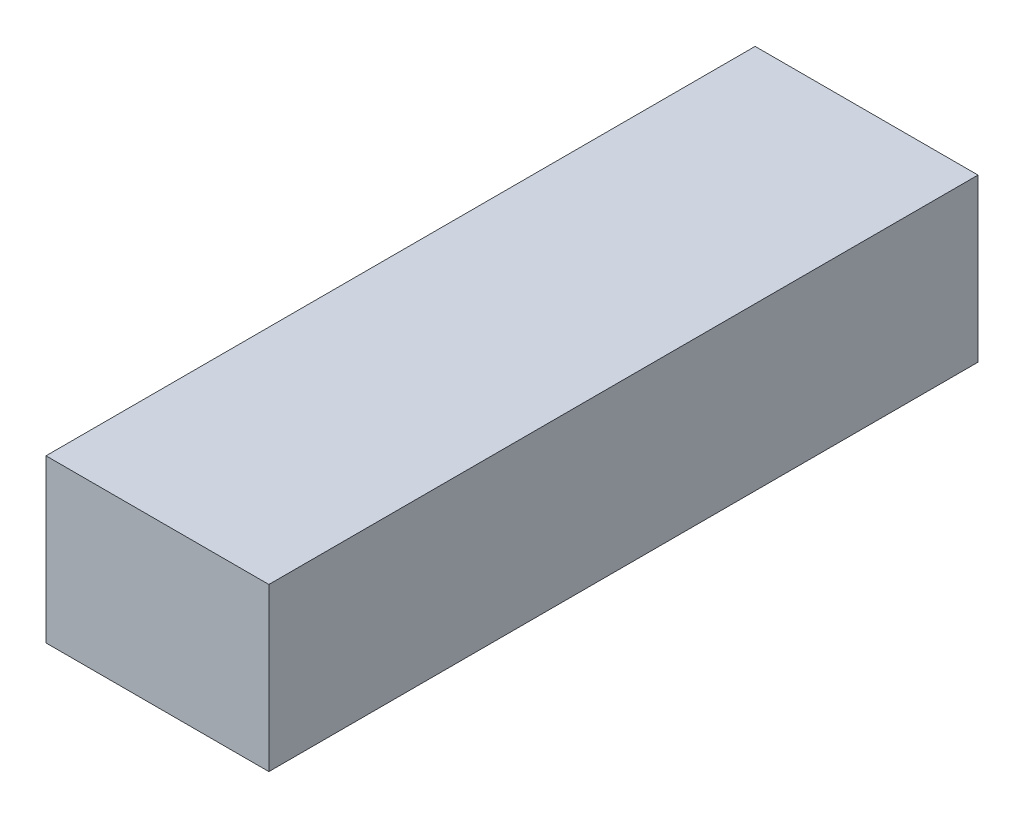
ISO-10303-21;
HEADER;
FILE_DESCRIPTION(('STEP AP214'),'2;1');
FILE_NAME('part.step','',(''),(''),'','','');
FILE_SCHEMA(('AUTOMOTIVE_DESIGN { 1 0 10303 214 1 1 1 1 }'));
ENDSEC;
DATA;
#1=APPLICATION_CONTEXT('core data for automotive mechanical design processes');
#2=APPLICATION_PROTOCOL_DEFINITION('international standard','automotive_design',2000,#1);
#3=PRODUCT_CONTEXT('',#1,'mechanical');
#4=PRODUCT('Part','Part','',(#3));
#5=PRODUCT_RELATED_PRODUCT_CATEGORY('part','',(#4));
#6=PRODUCT_DEFINITION_FORMATION('','',#4);
#7=PRODUCT_DEFINITION_CONTEXT('part definition',#1,'design');
#8=PRODUCT_DEFINITION('design','',#6,#7);
#9=PRODUCT_DEFINITION_SHAPE('','',#8);
#10=(LENGTH_UNIT() NAMED_UNIT(*) SI_UNIT(.MILLI.,.METRE.));
#11=(NAMED_UNIT(*) PLANE_ANGLE_UNIT() SI_UNIT($,.RADIAN.));
#12=(NAMED_UNIT(*) SI_UNIT($,.STERADIAN.) SOLID_ANGLE_UNIT());
#13=UNCERTAINTY_MEASURE_WITH_UNIT(LENGTH_MEASURE(1.E-05),#10,'distance_accuracy_value','');
#14=(GEOMETRIC_REPRESENTATION_CONTEXT(3) GLOBAL_UNCERTAINTY_ASSIGNED_CONTEXT((#13)) GLOBAL_UNIT_ASSIGNED_CONTEXT((#10,
#11,#12)) REPRESENTATION_CONTEXT('',''));
#15=CARTESIAN_POINT('',(0.,0.,0.));
#16=DIRECTION('',(0.,0.,1.));
#17=DIRECTION('',(1.,0.,0.));
#18=AXIS2_PLACEMENT_3D('',#15,#16,#17);
#19=CARTESIAN_POINT('',(16.5,24.,-52.5));
#20=DIRECTION('',(-1.,0.,0.));
#21=DIRECTION('',(0.,0.,1.));
#22=AXIS2_PLACEMENT_3D('',#19,#20,#21);
#23=PLANE('',#22);
#24=DIRECTION('',(0.,0.,-1.));
#25=VECTOR('',#24,1.);
#26=CARTESIAN_POINT('',(16.5,0.,-52.5));
#27=LINE('',#26,#25);
#28=CARTESIAN_POINT('',(16.5,0.,52.5));
#29=VERTEX_POINT('',#28);
#30=CARTESIAN_POINT('',(16.5,0.,-52.5));
#31=VERTEX_POINT('',#30);
#32=EDGE_CURVE('E96',#29,#31,#27,.T.);
#33=ORIENTED_EDGE('',*,*,#32,.T.);
#34=DIRECTION('',(0.,-1.,0.));
#35=VECTOR('',#34,1.);
#36=CARTESIAN_POINT('',(16.5,24.,-52.5));
#37=LINE('',#36,#35);
#38=CARTESIAN_POINT('',(16.5,24.,-52.5));
#39=VERTEX_POINT('',#38);
#40=EDGE_CURVE('E11',#39,#31,#37,.T.);
#41=ORIENTED_EDGE('',*,*,#40,.F.);
#42=DIRECTION('',(0.,0.,-1.));
#43=VECTOR('',#42,1.);
#44=CARTESIAN_POINT('',(16.5,24.,-52.5));
#45=LINE('',#44,#43);
#46=CARTESIAN_POINT('',(16.5,24.,52.5));
#47=VERTEX_POINT('',#46);
#48=EDGE_CURVE('E84',#47,#39,#45,.T.);
#49=ORIENTED_EDGE('',*,*,#48,.F.);
#50=DIRECTION('',(0.,-1.,0.));
#51=VECTOR('',#50,1.);
#52=CARTESIAN_POINT('',(16.5,24.,52.5));
#53=LINE('',#52,#51);
#54=EDGE_CURVE('E92',#47,#29,#53,.T.);
#55=ORIENTED_EDGE('',*,*,#54,.T.);
#56=EDGE_LOOP('',(#33,#41,#49,#55));
#57=FACE_BOUND('',#56,.T.);
#58=ADVANCED_FACE('F33',(#57),#23,.F.);
#59=CARTESIAN_POINT('',(-16.5,24.,-52.5));
#60=DIRECTION('',(0.,0.,1.));
#61=DIRECTION('',(1.,0.,0.));
#62=AXIS2_PLACEMENT_3D('',#59,#60,#61);
#63=PLANE('',#62);
#64=DIRECTION('',(-1.,0.,0.));
#65=VECTOR('',#64,1.);
#66=CARTESIAN_POINT('',(-16.5,0.,-52.5));
#67=LINE('',#66,#65);
#68=CARTESIAN_POINT('',(-16.5,0.,-52.5));
#69=VERTEX_POINT('',#68);
#70=EDGE_CURVE('E88',#31,#69,#67,.T.);
#71=ORIENTED_EDGE('',*,*,#70,.T.);
#72=DIRECTION('',(0.,-1.,0.));
#73=VECTOR('',#72,1.);
#74=CARTESIAN_POINT('',(-16.5,24.,-52.5));
#75=LINE('',#74,#73);
#76=CARTESIAN_POINT('',(-16.5,24.,-52.5));
#77=VERTEX_POINT('',#76);
#78=EDGE_CURVE('E41',#77,#69,#75,.T.);
#79=ORIENTED_EDGE('',*,*,#78,.F.);
#80=DIRECTION('',(-1.,0.,0.));
#81=VECTOR('',#80,1.);
#82=CARTESIAN_POINT('',(-16.5,24.,-52.5));
#83=LINE('',#82,#81);
#84=EDGE_CURVE('E79',#39,#77,#83,.T.);
#85=ORIENTED_EDGE('',*,*,#84,.F.);
#86=ORIENTED_EDGE('',*,*,#40,.T.);
#87=EDGE_LOOP('',(#71,#79,#85,#86));
#88=FACE_BOUND('',#87,.T.);
#89=ADVANCED_FACE('F87',(#88),#63,.F.);
#90=CARTESIAN_POINT('',(-16.5,24.,-52.5));
#91=DIRECTION('',(1.,0.,0.));
#92=DIRECTION('',(0.,0.,-1.));
#93=AXIS2_PLACEMENT_3D('',#90,#91,#92);
#94=PLANE('',#93);
#95=DIRECTION('',(0.,0.,1.));
#96=VECTOR('',#95,1.);
#97=CARTESIAN_POINT('',(-16.5,0.,-52.5));
#98=LINE('',#97,#96);
#99=CARTESIAN_POINT('',(-16.5,0.,52.5));
#100=VERTEX_POINT('',#99);
#101=EDGE_CURVE('E66',#69,#100,#98,.T.);
#102=ORIENTED_EDGE('',*,*,#101,.T.);
#103=DIRECTION('',(0.,-1.,0.));
#104=VECTOR('',#103,1.);
#105=CARTESIAN_POINT('',(-16.5,24.,52.5));
#106=LINE('',#105,#104);
#107=CARTESIAN_POINT('',(-16.5,24.,52.5));
#108=VERTEX_POINT('',#107);
#109=EDGE_CURVE('E89',#108,#100,#106,.T.);
#110=ORIENTED_EDGE('',*,*,#109,.F.);
#111=DIRECTION('',(0.,0.,1.));
#112=VECTOR('',#111,1.);
#113=CARTESIAN_POINT('',(-16.5,24.,-52.5));
#114=LINE('',#113,#112);
#115=EDGE_CURVE('E82',#77,#108,#114,.T.);
#116=ORIENTED_EDGE('',*,*,#115,.F.);
#117=ORIENTED_EDGE('',*,*,#78,.T.);
#118=EDGE_LOOP('',(#102,#110,#116,#117));
#119=FACE_BOUND('',#118,.T.);
#120=ADVANCED_FACE('F90',(#119),#94,.F.);
#121=CARTESIAN_POINT('',(-16.5,24.,52.5));
#122=DIRECTION('',(0.,0.,-1.));
#123=DIRECTION('',(-1.,0.,0.));
#124=AXIS2_PLACEMENT_3D('',#121,#122,#123);
#125=PLANE('',#124);
#126=DIRECTION('',(1.,0.,0.));
#127=VECTOR('',#126,1.);
#128=CARTESIAN_POINT('',(-16.5,0.,52.5));
#129=LINE('',#128,#127);
#130=EDGE_CURVE('E72',#100,#29,#129,.T.);
#131=ORIENTED_EDGE('',*,*,#130,.T.);
#132=ORIENTED_EDGE('',*,*,#54,.F.);
#133=DIRECTION('',(1.,0.,0.));
#134=VECTOR('',#133,1.);
#135=CARTESIAN_POINT('',(-16.5,24.,52.5));
#136=LINE('',#135,#134);
#137=EDGE_CURVE('E49',#108,#47,#136,.T.);
#138=ORIENTED_EDGE('',*,*,#137,.F.);
#139=ORIENTED_EDGE('',*,*,#109,.T.);
#140=EDGE_LOOP('',(#131,#132,#138,#139));
#141=FACE_BOUND('',#140,.T.);
#142=ADVANCED_FACE('F103',(#141),#125,.F.);
#143=CARTESIAN_POINT('',(0.,24.,0.));
#144=DIRECTION('',(0.,1.,0.));
#145=DIRECTION('',(0.,0.,1.));
#146=AXIS2_PLACEMENT_3D('',#143,#144,#145);
#147=PLANE('',#146);
#148=ORIENTED_EDGE('',*,*,#48,.T.);
#149=ORIENTED_EDGE('',*,*,#84,.T.);
#150=ORIENTED_EDGE('',*,*,#115,.T.);
#151=ORIENTED_EDGE('',*,*,#137,.T.);
#152=EDGE_LOOP('',(#148,#149,#150,#151));
#153=FACE_BOUND('',#152,.T.);
#154=ADVANCED_FACE('F80',(#153),#147,.T.);
#155=CARTESIAN_POINT('',(0.,0.,0.));
#156=DIRECTION('',(0.,1.,0.));
#157=DIRECTION('',(0.,0.,1.));
#158=AXIS2_PLACEMENT_3D('',#155,#156,#157);
#159=PLANE('',#158);
#160=ORIENTED_EDGE('',*,*,#32,.F.);
#161=ORIENTED_EDGE('',*,*,#130,.F.);
#162=ORIENTED_EDGE('',*,*,#101,.F.);
#163=ORIENTED_EDGE('',*,*,#70,.F.);
#164=EDGE_LOOP('',(#160,#161,#162,#163));
#165=FACE_BOUND('',#164,.T.);
#166=ADVANCED_FACE('F106',(#165),#159,.F.);
#167=CLOSED_SHELL('',(#58,#89,#120,#142,#154,#166));
#168=MANIFOLD_SOLID_BREP('B2',#167);
#169=ADVANCED_BREP_SHAPE_REPRESENTATION('',(#18,#168),#14);
#170=SHAPE_DEFINITION_REPRESENTATION(#9,#169);
ENDSEC;
END-ISO-10303-21;
